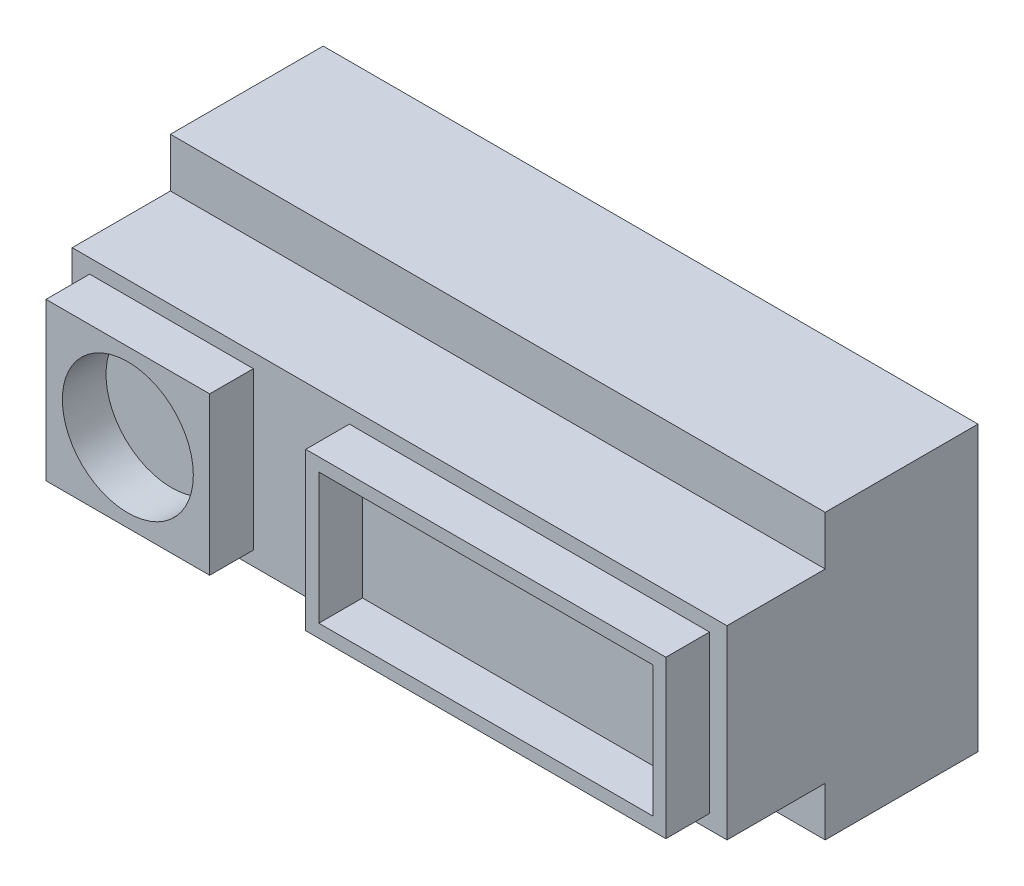
ISO-10303-21;
HEADER;
FILE_DESCRIPTION(('STEP AP214'),'2;1');
FILE_NAME('part.step','',(''),(''),'','','');
FILE_SCHEMA(('AUTOMOTIVE_DESIGN { 1 0 10303 214 1 1 1 1 }'));
ENDSEC;
DATA;
#1=APPLICATION_CONTEXT('core data for automotive mechanical design processes');
#2=APPLICATION_PROTOCOL_DEFINITION('international standard','automotive_design',2000,#1);
#3=PRODUCT_CONTEXT('',#1,'mechanical');
#4=PRODUCT('Part','Part','',(#3));
#5=PRODUCT_RELATED_PRODUCT_CATEGORY('part','',(#4));
#6=PRODUCT_DEFINITION_FORMATION('','',#4);
#7=PRODUCT_DEFINITION_CONTEXT('part definition',#1,'design');
#8=PRODUCT_DEFINITION('design','',#6,#7);
#9=PRODUCT_DEFINITION_SHAPE('','',#8);
#10=(LENGTH_UNIT() NAMED_UNIT(*) SI_UNIT(.MILLI.,.METRE.));
#11=(NAMED_UNIT(*) PLANE_ANGLE_UNIT() SI_UNIT($,.RADIAN.));
#12=(NAMED_UNIT(*) SI_UNIT($,.STERADIAN.) SOLID_ANGLE_UNIT());
#13=UNCERTAINTY_MEASURE_WITH_UNIT(LENGTH_MEASURE(1.E-05),#10,'distance_accuracy_value','');
#14=(GEOMETRIC_REPRESENTATION_CONTEXT(3) GLOBAL_UNCERTAINTY_ASSIGNED_CONTEXT((#13)) GLOBAL_UNIT_ASSIGNED_CONTEXT((#10,
#11,#12)) REPRESENTATION_CONTEXT('',''));
#15=CARTESIAN_POINT('',(0.,0.,0.));
#16=DIRECTION('',(0.,0.,1.));
#17=DIRECTION('',(1.,0.,0.));
#18=AXIS2_PLACEMENT_3D('',#15,#16,#17);
#19=CARTESIAN_POINT('',(-15.,2.25,11.5));
#20=DIRECTION('',(0.,1.,0.));
#21=DIRECTION('',(0.,0.,1.));
#22=AXIS2_PLACEMENT_3D('',#19,#20,#21);
#23=PLANE('',#22);
#24=DIRECTION('',(1.,0.,0.));
#25=VECTOR('',#24,1.);
#26=CARTESIAN_POINT('',(-15.,2.25,7.));
#27=LINE('',#26,#25);
#28=CARTESIAN_POINT('',(-15.,2.25,7.));
#29=VERTEX_POINT('',#28);
#30=CARTESIAN_POINT('',(-5.25,2.25,7.));
#31=VERTEX_POINT('',#30);
#32=EDGE_CURVE('E378',#29,#31,#27,.T.);
#33=ORIENTED_EDGE('',*,*,#32,.T.);
#34=DIRECTION('',(0.,0.,1.));
#35=VECTOR('',#34,1.);
#36=CARTESIAN_POINT('',(-5.25,2.25,-5.));
#37=LINE('',#36,#35);
#38=CARTESIAN_POINT('',(-5.25,2.25,0.));
#39=VERTEX_POINT('',#38);
#40=EDGE_CURVE('E255',#39,#31,#37,.T.);
#41=ORIENTED_EDGE('',*,*,#40,.F.);
#42=DIRECTION('',(-1.,0.,0.));
#43=VECTOR('',#42,1.);
#44=CARTESIAN_POINT('',(0.,2.25,0.));
#45=LINE('',#44,#43);
#46=CARTESIAN_POINT('',(5.25,2.25,0.));
#47=VERTEX_POINT('',#46);
#48=EDGE_CURVE('E269',#47,#39,#45,.T.);
#49=ORIENTED_EDGE('',*,*,#48,.F.);
#50=DIRECTION('',(0.,0.,1.));
#51=VECTOR('',#50,1.);
#52=CARTESIAN_POINT('',(5.25,2.25,-5.));
#53=LINE('',#52,#51);
#54=CARTESIAN_POINT('',(5.25,2.25,7.));
#55=VERTEX_POINT('',#54);
#56=EDGE_CURVE('E254',#47,#55,#53,.T.);
#57=ORIENTED_EDGE('',*,*,#56,.T.);
#58=CARTESIAN_POINT('',(15.,2.25,7.));
#59=VERTEX_POINT('',#58);
#60=EDGE_CURVE('E40',#55,#59,#27,.T.);
#61=ORIENTED_EDGE('',*,*,#60,.T.);
#62=DIRECTION('',(0.,0.,-1.));
#63=VECTOR('',#62,1.);
#64=CARTESIAN_POINT('',(15.,2.25,11.5));
#65=LINE('',#64,#63);
#66=CARTESIAN_POINT('',(15.,2.25,11.5));
#67=VERTEX_POINT('',#66);
#68=EDGE_CURVE('E385',#67,#59,#65,.T.);
#69=ORIENTED_EDGE('',*,*,#68,.F.);
#70=DIRECTION('',(1.,0.,0.));
#71=VECTOR('',#70,1.);
#72=CARTESIAN_POINT('',(-15.,2.25,11.5));
#73=LINE('',#72,#71);
#74=CARTESIAN_POINT('',(-15.,2.25,11.5));
#75=VERTEX_POINT('',#74);
#76=EDGE_CURVE('E365',#75,#67,#73,.T.);
#77=ORIENTED_EDGE('',*,*,#76,.F.);
#78=DIRECTION('',(0.,0.,-1.));
#79=VECTOR('',#78,1.);
#80=CARTESIAN_POINT('',(-15.,2.25,11.5));
#81=LINE('',#80,#79);
#82=EDGE_CURVE('E388',#75,#29,#81,.T.);
#83=ORIENTED_EDGE('',*,*,#82,.T.);
#84=EDGE_LOOP('',(#33,#41,#49,#57,#61,#69,#77,#83));
#85=FACE_BOUND('',#84,.T.);
#86=DIRECTION('',(0.,0.,-1.));
#87=VECTOR('',#86,1.);
#88=CARTESIAN_POINT('',(-5.,2.25,3.6));
#89=LINE('',#88,#87);
#90=CARTESIAN_POINT('',(-5.,2.25,3.6));
#91=VERTEX_POINT('',#90);
#92=CARTESIAN_POINT('',(-5.,2.25,2.5));
#93=VERTEX_POINT('',#92);
#94=EDGE_CURVE('E243',#91,#93,#89,.T.);
#95=ORIENTED_EDGE('',*,*,#94,.F.);
#96=DIRECTION('',(-1.,0.,0.));
#97=VECTOR('',#96,1.);
#98=CARTESIAN_POINT('',(-5.,2.25,3.6));
#99=LINE('',#98,#97);
#100=CARTESIAN_POINT('',(5.,2.25,3.6));
#101=VERTEX_POINT('',#100);
#102=EDGE_CURVE('E240',#101,#91,#99,.T.);
#103=ORIENTED_EDGE('',*,*,#102,.F.);
#104=DIRECTION('',(0.,0.,1.));
#105=VECTOR('',#104,1.);
#106=CARTESIAN_POINT('',(5.,2.25,3.6));
#107=LINE('',#106,#105);
#108=CARTESIAN_POINT('',(5.,2.25,2.5));
#109=VERTEX_POINT('',#108);
#110=EDGE_CURVE('E58',#109,#101,#107,.T.);
#111=ORIENTED_EDGE('',*,*,#110,.F.);
#112=DIRECTION('',(1.,0.,0.));
#113=VECTOR('',#112,1.);
#114=CARTESIAN_POINT('',(-5.,2.25,2.5));
#115=LINE('',#114,#113);
#116=EDGE_CURVE('E53',#93,#109,#115,.T.);
#117=ORIENTED_EDGE('',*,*,#116,.F.);
#118=EDGE_LOOP('',(#95,#103,#111,#117));
#119=FACE_BOUND('',#118,.T.);
#120=ADVANCED_FACE('F36',(#85,#119),#23,.F.);
#121=CARTESIAN_POINT('',(-15.,0.,1.4));
#122=DIRECTION('',(0.,1.,0.));
#123=DIRECTION('',(0.,0.,1.));
#124=AXIS2_PLACEMENT_3D('',#121,#122,#123);
#125=PLANE('',#124);
#126=DIRECTION('',(0.,0.,-1.));
#127=VECTOR('',#126,1.);
#128=CARTESIAN_POINT('',(-5.25,0.,1.4));
#129=LINE('',#128,#127);
#130=CARTESIAN_POINT('',(-5.25,0.,7.));
#131=VERTEX_POINT('',#130);
#132=CARTESIAN_POINT('',(-5.25,0.,0.));
#133=VERTEX_POINT('',#132);
#134=EDGE_CURVE('E267',#131,#133,#129,.T.);
#135=ORIENTED_EDGE('',*,*,#134,.F.);
#136=DIRECTION('',(1.,0.,0.));
#137=VECTOR('',#136,1.);
#138=CARTESIAN_POINT('',(-15.,0.,7.));
#139=LINE('',#138,#137);
#140=CARTESIAN_POINT('',(-15.,0.,7.));
#141=VERTEX_POINT('',#140);
#142=EDGE_CURVE('E421',#141,#131,#139,.T.);
#143=ORIENTED_EDGE('',*,*,#142,.F.);
#144=DIRECTION('',(0.,0.,-1.));
#145=VECTOR('',#144,1.);
#146=CARTESIAN_POINT('',(-15.,0.,1.4));
#147=LINE('',#146,#145);
#148=CARTESIAN_POINT('',(-15.,0.,0.));
#149=VERTEX_POINT('',#148);
#150=EDGE_CURVE('E442',#141,#149,#147,.T.);
#151=ORIENTED_EDGE('',*,*,#150,.T.);
#152=DIRECTION('',(1.,0.,0.));
#153=VECTOR('',#152,1.);
#154=CARTESIAN_POINT('',(-15.,0.,0.));
#155=LINE('',#154,#153);
#156=EDGE_CURVE('E448',#149,#133,#155,.T.);
#157=ORIENTED_EDGE('',*,*,#156,.T.);
#158=EDGE_LOOP('',(#135,#143,#151,#157));
#159=FACE_BOUND('',#158,.T.);
#160=ADVANCED_FACE('F493',(#159),#125,.F.);
#161=CARTESIAN_POINT('',(0.,0.,0.));
#162=DIRECTION('',(0.,0.,1.));
#163=DIRECTION('',(1.,0.,0.));
#164=AXIS2_PLACEMENT_3D('',#161,#162,#163);
#165=PLANE('',#164);
#166=DIRECTION('',(0.,1.,0.));
#167=VECTOR('',#166,1.);
#168=CARTESIAN_POINT('',(-5.25,0.,0.));
#169=LINE('',#168,#167);
#170=EDGE_CURVE('E265',#133,#39,#169,.T.);
#171=ORIENTED_EDGE('',*,*,#170,.F.);
#172=ORIENTED_EDGE('',*,*,#156,.F.);
#173=DIRECTION('',(0.,-1.,0.));
#174=VECTOR('',#173,1.);
#175=CARTESIAN_POINT('',(-15.,13.,0.));
#176=LINE('',#175,#174);
#177=CARTESIAN_POINT('',(-15.,13.,0.));
#178=VERTEX_POINT('',#177);
#179=EDGE_CURVE('E452',#178,#149,#176,.T.);
#180=ORIENTED_EDGE('',*,*,#179,.F.);
#181=DIRECTION('',(-1.,0.,0.));
#182=VECTOR('',#181,1.);
#183=CARTESIAN_POINT('',(15.,13.,0.));
#184=LINE('',#183,#182);
#185=CARTESIAN_POINT('',(15.,13.,0.));
#186=VERTEX_POINT('',#185);
#187=EDGE_CURVE('E454',#186,#178,#184,.T.);
#188=ORIENTED_EDGE('',*,*,#187,.F.);
#189=DIRECTION('',(0.,1.,0.));
#190=VECTOR('',#189,1.);
#191=CARTESIAN_POINT('',(15.,13.,0.));
#192=LINE('',#191,#190);
#193=CARTESIAN_POINT('',(15.,0.,0.));
#194=VERTEX_POINT('',#193);
#195=EDGE_CURVE('E455',#194,#186,#192,.T.);
#196=ORIENTED_EDGE('',*,*,#195,.F.);
#197=CARTESIAN_POINT('',(5.25,0.,0.));
#198=VERTEX_POINT('',#197);
#199=EDGE_CURVE('E451',#198,#194,#155,.T.);
#200=ORIENTED_EDGE('',*,*,#199,.F.);
#201=DIRECTION('',(0.,1.,0.));
#202=VECTOR('',#201,1.);
#203=CARTESIAN_POINT('',(5.25,0.,0.));
#204=LINE('',#203,#202);
#205=EDGE_CURVE('E257',#198,#47,#204,.T.);
#206=ORIENTED_EDGE('',*,*,#205,.T.);
#207=ORIENTED_EDGE('',*,*,#48,.T.);
#208=EDGE_LOOP('',(#171,#172,#180,#188,#196,#200,#206,#207));
#209=FACE_BOUND('',#208,.T.);
#210=ADVANCED_FACE('F483',(#209),#165,.F.);
#211=CARTESIAN_POINT('',(0.,0.,7.));
#212=DIRECTION('',(0.,0.,1.));
#213=DIRECTION('',(1.,0.,0.));
#214=AXIS2_PLACEMENT_3D('',#211,#212,#213);
#215=PLANE('',#214);
#216=ORIENTED_EDGE('',*,*,#142,.T.);
#217=DIRECTION('',(0.,1.,0.));
#218=VECTOR('',#217,1.);
#219=CARTESIAN_POINT('',(-5.25,0.,7.));
#220=LINE('',#219,#218);
#221=EDGE_CURVE('E246',#131,#31,#220,.T.);
#222=ORIENTED_EDGE('',*,*,#221,.T.);
#223=ORIENTED_EDGE('',*,*,#32,.F.);
#224=DIRECTION('',(0.,-1.,0.));
#225=VECTOR('',#224,1.);
#226=CARTESIAN_POINT('',(-15.,13.,7.));
#227=LINE('',#226,#225);
#228=EDGE_CURVE('E394',#29,#141,#227,.T.);
#229=ORIENTED_EDGE('',*,*,#228,.T.);
#230=EDGE_LOOP('',(#216,#222,#223,#229));
#231=FACE_BOUND('',#230,.T.);
#232=ADVANCED_FACE('F505',(#231),#215,.T.);
#233=CARTESIAN_POINT('',(0.,0.,11.5));
#234=DIRECTION('',(0.,0.,1.));
#235=DIRECTION('',(1.,0.,0.));
#236=AXIS2_PLACEMENT_3D('',#233,#234,#235);
#237=PLANE('',#236);
#238=DIRECTION('',(0.,-1.,0.));
#239=VECTOR('',#238,1.);
#240=CARTESIAN_POINT('',(-15.,10.75,11.5));
#241=LINE('',#240,#239);
#242=CARTESIAN_POINT('',(-15.,10.75,11.5));
#243=VERTEX_POINT('',#242);
#244=EDGE_CURVE('E362',#243,#75,#241,.T.);
#245=ORIENTED_EDGE('',*,*,#244,.T.);
#246=ORIENTED_EDGE('',*,*,#76,.T.);
#247=DIRECTION('',(0.,1.,0.));
#248=VECTOR('',#247,1.);
#249=CARTESIAN_POINT('',(15.,10.75,11.5));
#250=LINE('',#249,#248);
#251=CARTESIAN_POINT('',(15.,10.75,11.5));
#252=VERTEX_POINT('',#251);
#253=EDGE_CURVE('E368',#67,#252,#250,.T.);
#254=ORIENTED_EDGE('',*,*,#253,.T.);
#255=DIRECTION('',(-1.,0.,0.));
#256=VECTOR('',#255,1.);
#257=CARTESIAN_POINT('',(-15.,10.75,11.5));
#258=LINE('',#257,#256);
#259=EDGE_CURVE('E370',#252,#243,#258,.T.);
#260=ORIENTED_EDGE('',*,*,#259,.T.);
#261=EDGE_LOOP('',(#245,#246,#254,#260));
#262=FACE_BOUND('',#261,.T.);
#263=DIRECTION('',(1.,0.,0.));
#264=VECTOR('',#263,1.);
#265=CARTESIAN_POINT('',(-2.3,2.9,11.5));
#266=LINE('',#265,#264);
#267=CARTESIAN_POINT('',(-2.3,2.9,11.5));
#268=VERTEX_POINT('',#267);
#269=CARTESIAN_POINT('',(14.2,2.9,11.5));
#270=VERTEX_POINT('',#269);
#271=EDGE_CURVE('E347',#268,#270,#266,.T.);
#272=ORIENTED_EDGE('',*,*,#271,.F.);
#273=DIRECTION('',(0.,-1.,0.));
#274=VECTOR('',#273,1.);
#275=CARTESIAN_POINT('',(-2.3,10.1,11.5));
#276=LINE('',#275,#274);
#277=CARTESIAN_POINT('',(-2.3,10.1,11.5));
#278=VERTEX_POINT('',#277);
#279=EDGE_CURVE('E333',#278,#268,#276,.T.);
#280=ORIENTED_EDGE('',*,*,#279,.F.);
#281=DIRECTION('',(-1.,0.,0.));
#282=VECTOR('',#281,1.);
#283=CARTESIAN_POINT('',(-2.3,10.1,11.5));
#284=LINE('',#283,#282);
#285=CARTESIAN_POINT('',(14.2,10.1,11.5));
#286=VERTEX_POINT('',#285);
#287=EDGE_CURVE('E338',#286,#278,#284,.T.);
#288=ORIENTED_EDGE('',*,*,#287,.F.);
#289=DIRECTION('',(0.,1.,0.));
#290=VECTOR('',#289,1.);
#291=CARTESIAN_POINT('',(14.2,10.1,11.5));
#292=LINE('',#291,#290);
#293=EDGE_CURVE('E349',#270,#286,#292,.T.);
#294=ORIENTED_EDGE('',*,*,#293,.F.);
#295=EDGE_LOOP('',(#272,#280,#288,#294));
#296=FACE_BOUND('',#295,.T.);
#297=DIRECTION('',(1.,0.,0.));
#298=VECTOR('',#297,1.);
#299=CARTESIAN_POINT('',(-14.2,2.9,11.5));
#300=LINE('',#299,#298);
#301=CARTESIAN_POINT('',(-14.2,2.9,11.5));
#302=VERTEX_POINT('',#301);
#303=CARTESIAN_POINT('',(-6.7,2.9,11.5));
#304=VERTEX_POINT('',#303);
#305=EDGE_CURVE('E289',#302,#304,#300,.T.);
#306=ORIENTED_EDGE('',*,*,#305,.F.);
#307=DIRECTION('',(0.,-1.,0.));
#308=VECTOR('',#307,1.);
#309=CARTESIAN_POINT('',(-14.2,10.1,11.5));
#310=LINE('',#309,#308);
#311=CARTESIAN_POINT('',(-14.2,10.1,11.5));
#312=VERTEX_POINT('',#311);
#313=EDGE_CURVE('E275',#312,#302,#310,.T.);
#314=ORIENTED_EDGE('',*,*,#313,.F.);
#315=DIRECTION('',(-1.,0.,0.));
#316=VECTOR('',#315,1.);
#317=CARTESIAN_POINT('',(-14.2,10.1,11.5));
#318=LINE('',#317,#316);
#319=CARTESIAN_POINT('',(-6.7,10.1,11.5));
#320=VERTEX_POINT('',#319);
#321=EDGE_CURVE('E280',#320,#312,#318,.T.);
#322=ORIENTED_EDGE('',*,*,#321,.F.);
#323=DIRECTION('',(0.,1.,0.));
#324=VECTOR('',#323,1.);
#325=CARTESIAN_POINT('',(-6.7,10.1,11.5));
#326=LINE('',#325,#324);
#327=EDGE_CURVE('E291',#304,#320,#326,.T.);
#328=ORIENTED_EDGE('',*,*,#327,.F.);
#329=EDGE_LOOP('',(#306,#314,#322,#328));
#330=FACE_BOUND('',#329,.T.);
#331=ADVANCED_FACE('F467',(#262,#296,#330),#237,.T.);
#332=DIRECTION('',(-1.,0.,0.));
#333=VECTOR('',#332,1.);
#334=CARTESIAN_POINT('',(-15.,10.75,7.));
#335=LINE('',#334,#333);
#336=CARTESIAN_POINT('',(15.,10.75,7.));
#337=VERTEX_POINT('',#336);
#338=CARTESIAN_POINT('',(-15.,10.75,7.));
#339=VERTEX_POINT('',#338);
#340=EDGE_CURVE('E366',#337,#339,#335,.T.);
#341=ORIENTED_EDGE('',*,*,#340,.F.);
#342=DIRECTION('',(0.,1.,0.));
#343=VECTOR('',#342,1.);
#344=CARTESIAN_POINT('',(15.,13.,7.));
#345=LINE('',#344,#343);
#346=CARTESIAN_POINT('',(15.,13.,7.));
#347=VERTEX_POINT('',#346);
#348=EDGE_CURVE('E382',#337,#347,#345,.T.);
#349=ORIENTED_EDGE('',*,*,#348,.T.);
#350=DIRECTION('',(-1.,0.,0.));
#351=VECTOR('',#350,1.);
#352=CARTESIAN_POINT('',(-15.,13.,7.));
#353=LINE('',#352,#351);
#354=CARTESIAN_POINT('',(-15.,13.,7.));
#355=VERTEX_POINT('',#354);
#356=EDGE_CURVE('E423',#347,#355,#353,.T.);
#357=ORIENTED_EDGE('',*,*,#356,.T.);
#358=EDGE_CURVE('E429',#355,#339,#227,.T.);
#359=ORIENTED_EDGE('',*,*,#358,.T.);
#360=EDGE_LOOP('',(#341,#349,#357,#359));
#361=FACE_BOUND('',#360,.T.);
#362=ADVANCED_FACE('F458',(#361),#215,.T.);
#363=CARTESIAN_POINT('',(15.,13.,1.4));
#364=DIRECTION('',(-1.,0.,0.));
#365=DIRECTION('',(0.,0.,1.));
#366=AXIS2_PLACEMENT_3D('',#363,#364,#365);
#367=PLANE('',#366);
#368=ORIENTED_EDGE('',*,*,#195,.T.);
#369=DIRECTION('',(0.,0.,-1.));
#370=VECTOR('',#369,1.);
#371=CARTESIAN_POINT('',(15.,13.,1.4));
#372=LINE('',#371,#370);
#373=EDGE_CURVE('E46',#347,#186,#372,.T.);
#374=ORIENTED_EDGE('',*,*,#373,.F.);
#375=ORIENTED_EDGE('',*,*,#348,.F.);
#376=DIRECTION('',(0.,0.,-1.));
#377=VECTOR('',#376,1.);
#378=CARTESIAN_POINT('',(15.,10.75,11.5));
#379=LINE('',#378,#377);
#380=EDGE_CURVE('E389',#252,#337,#379,.T.);
#381=ORIENTED_EDGE('',*,*,#380,.F.);
#382=ORIENTED_EDGE('',*,*,#253,.F.);
#383=ORIENTED_EDGE('',*,*,#68,.T.);
#384=CARTESIAN_POINT('',(15.,0.,7.));
#385=VERTEX_POINT('',#384);
#386=EDGE_CURVE('E420',#385,#59,#345,.T.);
#387=ORIENTED_EDGE('',*,*,#386,.F.);
#388=DIRECTION('',(0.,0.,-1.));
#389=VECTOR('',#388,1.);
#390=CARTESIAN_POINT('',(15.,0.,1.4));
#391=LINE('',#390,#389);
#392=EDGE_CURVE('E445',#385,#194,#391,.T.);
#393=ORIENTED_EDGE('',*,*,#392,.T.);
#394=EDGE_LOOP('',(#368,#374,#375,#381,#382,#383,#387,#393));
#395=FACE_BOUND('',#394,.T.);
#396=ADVANCED_FACE('F38',(#395),#367,.F.);
#397=CARTESIAN_POINT('',(15.,13.,1.4));
#398=DIRECTION('',(0.,-1.,0.));
#399=DIRECTION('',(0.,0.,-1.));
#400=AXIS2_PLACEMENT_3D('',#397,#398,#399);
#401=PLANE('',#400);
#402=ORIENTED_EDGE('',*,*,#187,.T.);
#403=DIRECTION('',(0.,0.,-1.));
#404=VECTOR('',#403,1.);
#405=CARTESIAN_POINT('',(-15.,13.,1.4));
#406=LINE('',#405,#404);
#407=EDGE_CURVE('E439',#355,#178,#406,.T.);
#408=ORIENTED_EDGE('',*,*,#407,.F.);
#409=ORIENTED_EDGE('',*,*,#356,.F.);
#410=ORIENTED_EDGE('',*,*,#373,.T.);
#411=EDGE_LOOP('',(#402,#408,#409,#410));
#412=FACE_BOUND('',#411,.T.);
#413=ADVANCED_FACE('F485',(#412),#401,.F.);
#414=CARTESIAN_POINT('',(-15.,13.,1.4));
#415=DIRECTION('',(1.,0.,0.));
#416=DIRECTION('',(0.,0.,-1.));
#417=AXIS2_PLACEMENT_3D('',#414,#415,#416);
#418=PLANE('',#417);
#419=ORIENTED_EDGE('',*,*,#179,.T.);
#420=ORIENTED_EDGE('',*,*,#150,.F.);
#421=ORIENTED_EDGE('',*,*,#228,.F.);
#422=ORIENTED_EDGE('',*,*,#82,.F.);
#423=ORIENTED_EDGE('',*,*,#244,.F.);
#424=DIRECTION('',(0.,0.,-1.));
#425=VECTOR('',#424,1.);
#426=CARTESIAN_POINT('',(-15.,10.75,11.5));
#427=LINE('',#426,#425);
#428=EDGE_CURVE('E371',#243,#339,#427,.T.);
#429=ORIENTED_EDGE('',*,*,#428,.T.);
#430=ORIENTED_EDGE('',*,*,#358,.F.);
#431=ORIENTED_EDGE('',*,*,#407,.T.);
#432=EDGE_LOOP('',(#419,#420,#421,#422,#423,#429,#430,#431));
#433=FACE_BOUND('',#432,.T.);
#434=ADVANCED_FACE('F461',(#433),#418,.F.);
#435=CARTESIAN_POINT('',(5.25,0.,7.));
#436=VERTEX_POINT('',#435);
#437=EDGE_CURVE('E425',#436,#385,#139,.T.);
#438=ORIENTED_EDGE('',*,*,#437,.F.);
#439=DIRECTION('',(0.,0.,-1.));
#440=VECTOR('',#439,1.);
#441=CARTESIAN_POINT('',(5.25,0.,1.4));
#442=LINE('',#441,#440);
#443=EDGE_CURVE('E262',#436,#198,#442,.T.);
#444=ORIENTED_EDGE('',*,*,#443,.T.);
#445=ORIENTED_EDGE('',*,*,#199,.T.);
#446=ORIENTED_EDGE('',*,*,#392,.F.);
#447=EDGE_LOOP('',(#438,#444,#445,#446));
#448=FACE_BOUND('',#447,.T.);
#449=ADVANCED_FACE('F479',(#448),#125,.F.);
#450=DIRECTION('',(0.,1.,0.));
#451=VECTOR('',#450,1.);
#452=CARTESIAN_POINT('',(5.25,0.,7.));
#453=LINE('',#452,#451);
#454=EDGE_CURVE('E244',#436,#55,#453,.T.);
#455=ORIENTED_EDGE('',*,*,#454,.F.);
#456=ORIENTED_EDGE('',*,*,#437,.T.);
#457=ORIENTED_EDGE('',*,*,#386,.T.);
#458=ORIENTED_EDGE('',*,*,#60,.F.);
#459=EDGE_LOOP('',(#455,#456,#457,#458));
#460=FACE_BOUND('',#459,.T.);
#461=ADVANCED_FACE('F476',(#460),#215,.T.);
#462=CARTESIAN_POINT('',(-15.,10.75,11.5));
#463=DIRECTION('',(0.,-1.,0.));
#464=DIRECTION('',(0.,0.,-1.));
#465=AXIS2_PLACEMENT_3D('',#462,#463,#464);
#466=PLANE('',#465);
#467=ORIENTED_EDGE('',*,*,#340,.T.);
#468=ORIENTED_EDGE('',*,*,#428,.F.);
#469=ORIENTED_EDGE('',*,*,#259,.F.);
#470=ORIENTED_EDGE('',*,*,#380,.T.);
#471=EDGE_LOOP('',(#467,#468,#469,#470));
#472=FACE_BOUND('',#471,.T.);
#473=ADVANCED_FACE('F409',(#472),#466,.F.);
#474=CARTESIAN_POINT('',(0.,0.,13.5));
#475=DIRECTION('',(0.,0.,1.));
#476=DIRECTION('',(1.,0.,0.));
#477=AXIS2_PLACEMENT_3D('',#474,#475,#476);
#478=PLANE('',#477);
#479=DIRECTION('',(0.,-1.,0.));
#480=VECTOR('',#479,1.);
#481=CARTESIAN_POINT('',(-2.3,10.1,13.5));
#482=LINE('',#481,#480);
#483=CARTESIAN_POINT('',(-2.3,10.1,13.5));
#484=VERTEX_POINT('',#483);
#485=CARTESIAN_POINT('',(-2.3,2.9,13.5));
#486=VERTEX_POINT('',#485);
#487=EDGE_CURVE('E334',#484,#486,#482,.T.);
#488=ORIENTED_EDGE('',*,*,#487,.T.);
#489=DIRECTION('',(1.,0.,0.));
#490=VECTOR('',#489,1.);
#491=CARTESIAN_POINT('',(-2.3,2.9,13.5));
#492=LINE('',#491,#490);
#493=CARTESIAN_POINT('',(14.2,2.9,13.5));
#494=VERTEX_POINT('',#493);
#495=EDGE_CURVE('E337',#486,#494,#492,.T.);
#496=ORIENTED_EDGE('',*,*,#495,.T.);
#497=DIRECTION('',(0.,1.,0.));
#498=VECTOR('',#497,1.);
#499=CARTESIAN_POINT('',(14.2,10.1,13.5));
#500=LINE('',#499,#498);
#501=CARTESIAN_POINT('',(14.2,10.1,13.5));
#502=VERTEX_POINT('',#501);
#503=EDGE_CURVE('E340',#494,#502,#500,.T.);
#504=ORIENTED_EDGE('',*,*,#503,.T.);
#505=DIRECTION('',(-1.,0.,0.));
#506=VECTOR('',#505,1.);
#507=CARTESIAN_POINT('',(-2.3,10.1,13.5));
#508=LINE('',#507,#506);
#509=EDGE_CURVE('E342',#502,#484,#508,.T.);
#510=ORIENTED_EDGE('',*,*,#509,.T.);
#511=EDGE_LOOP('',(#488,#496,#504,#510));
#512=FACE_BOUND('',#511,.T.);
#513=DIRECTION('',(1.,0.,0.));
#514=VECTOR('',#513,1.);
#515=CARTESIAN_POINT('',(-1.7,3.5,13.5));
#516=LINE('',#515,#514);
#517=CARTESIAN_POINT('',(-1.7,3.5,13.5));
#518=VERTEX_POINT('',#517);
#519=CARTESIAN_POINT('',(13.6,3.5,13.5));
#520=VERTEX_POINT('',#519);
#521=EDGE_CURVE('E307',#518,#520,#516,.T.);
#522=ORIENTED_EDGE('',*,*,#521,.F.);
#523=DIRECTION('',(0.,-1.,0.));
#524=VECTOR('',#523,1.);
#525=CARTESIAN_POINT('',(-1.7,9.5,13.5));
#526=LINE('',#525,#524);
#527=CARTESIAN_POINT('',(-1.7,9.5,13.5));
#528=VERTEX_POINT('',#527);
#529=EDGE_CURVE('E305',#528,#518,#526,.T.);
#530=ORIENTED_EDGE('',*,*,#529,.F.);
#531=DIRECTION('',(-1.,0.,0.));
#532=VECTOR('',#531,1.);
#533=CARTESIAN_POINT('',(-1.7,9.5,13.5));
#534=LINE('',#533,#532);
#535=CARTESIAN_POINT('',(13.6,9.5,13.5));
#536=VERTEX_POINT('',#535);
#537=EDGE_CURVE('E313',#536,#528,#534,.T.);
#538=ORIENTED_EDGE('',*,*,#537,.F.);
#539=DIRECTION('',(0.,1.,0.));
#540=VECTOR('',#539,1.);
#541=CARTESIAN_POINT('',(13.6,9.5,13.5));
#542=LINE('',#541,#540);
#543=EDGE_CURVE('E310',#520,#536,#542,.T.);
#544=ORIENTED_EDGE('',*,*,#543,.F.);
#545=EDGE_LOOP('',(#522,#530,#538,#544));
#546=FACE_BOUND('',#545,.T.);
#547=ADVANCED_FACE('F524',(#512,#546),#478,.T.);
#548=CARTESIAN_POINT('',(-2.3,10.1,13.5));
#549=DIRECTION('',(1.,0.,0.));
#550=DIRECTION('',(0.,1.,0.));
#551=AXIS2_PLACEMENT_3D('',#548,#549,#550);
#552=PLANE('',#551);
#553=ORIENTED_EDGE('',*,*,#279,.T.);
#554=DIRECTION('',(0.,0.,-1.));
#555=VECTOR('',#554,1.);
#556=CARTESIAN_POINT('',(-2.3,2.9,13.5));
#557=LINE('',#556,#555);
#558=EDGE_CURVE('E360',#486,#268,#557,.T.);
#559=ORIENTED_EDGE('',*,*,#558,.F.);
#560=ORIENTED_EDGE('',*,*,#487,.F.);
#561=DIRECTION('',(0.,0.,-1.));
#562=VECTOR('',#561,1.);
#563=CARTESIAN_POINT('',(-2.3,10.1,13.5));
#564=LINE('',#563,#562);
#565=EDGE_CURVE('E344',#484,#278,#564,.T.);
#566=ORIENTED_EDGE('',*,*,#565,.T.);
#567=EDGE_LOOP('',(#553,#559,#560,#566));
#568=FACE_BOUND('',#567,.T.);
#569=ADVANCED_FACE('F531',(#568),#552,.F.);
#570=CARTESIAN_POINT('',(-2.3,2.9,13.5));
#571=DIRECTION('',(0.,1.,0.));
#572=DIRECTION('',(0.,0.,1.));
#573=AXIS2_PLACEMENT_3D('',#570,#571,#572);
#574=PLANE('',#573);
#575=ORIENTED_EDGE('',*,*,#271,.T.);
#576=DIRECTION('',(0.,0.,-1.));
#577=VECTOR('',#576,1.);
#578=CARTESIAN_POINT('',(14.2,2.9,13.5));
#579=LINE('',#578,#577);
#580=EDGE_CURVE('E357',#494,#270,#579,.T.);
#581=ORIENTED_EDGE('',*,*,#580,.F.);
#582=ORIENTED_EDGE('',*,*,#495,.F.);
#583=ORIENTED_EDGE('',*,*,#558,.T.);
#584=EDGE_LOOP('',(#575,#581,#582,#583));
#585=FACE_BOUND('',#584,.T.);
#586=ADVANCED_FACE('F539',(#585),#574,.F.);
#587=CARTESIAN_POINT('',(14.2,10.1,13.5));
#588=DIRECTION('',(-1.,0.,0.));
#589=DIRECTION('',(0.,-1.,0.));
#590=AXIS2_PLACEMENT_3D('',#587,#588,#589);
#591=PLANE('',#590);
#592=ORIENTED_EDGE('',*,*,#293,.T.);
#593=DIRECTION('',(0.,0.,-1.));
#594=VECTOR('',#593,1.);
#595=CARTESIAN_POINT('',(14.2,10.1,13.5));
#596=LINE('',#595,#594);
#597=EDGE_CURVE('E355',#502,#286,#596,.T.);
#598=ORIENTED_EDGE('',*,*,#597,.F.);
#599=ORIENTED_EDGE('',*,*,#503,.F.);
#600=ORIENTED_EDGE('',*,*,#580,.T.);
#601=EDGE_LOOP('',(#592,#598,#599,#600));
#602=FACE_BOUND('',#601,.T.);
#603=ADVANCED_FACE('F547',(#602),#591,.F.);
#604=CARTESIAN_POINT('',(-2.3,10.1,13.5));
#605=DIRECTION('',(0.,-1.,0.));
#606=DIRECTION('',(0.,0.,-1.));
#607=AXIS2_PLACEMENT_3D('',#604,#605,#606);
#608=PLANE('',#607);
#609=ORIENTED_EDGE('',*,*,#287,.T.);
#610=ORIENTED_EDGE('',*,*,#565,.F.);
#611=ORIENTED_EDGE('',*,*,#509,.F.);
#612=ORIENTED_EDGE('',*,*,#597,.T.);
#613=EDGE_LOOP('',(#609,#610,#611,#612));
#614=FACE_BOUND('',#613,.T.);
#615=ADVANCED_FACE('F555',(#614),#608,.F.);
#616=CARTESIAN_POINT('',(-1.7,9.5,13.5));
#617=DIRECTION('',(1.,0.,0.));
#618=DIRECTION('',(0.,1.,0.));
#619=AXIS2_PLACEMENT_3D('',#616,#617,#618);
#620=PLANE('',#619);
#621=DIRECTION('',(0.,-1.,0.));
#622=VECTOR('',#621,1.);
#623=CARTESIAN_POINT('',(-1.7,9.5,11.5));
#624=LINE('',#623,#622);
#625=CARTESIAN_POINT('',(-1.7,9.5,11.5));
#626=VERTEX_POINT('',#625);
#627=CARTESIAN_POINT('',(-1.7,3.5,11.5));
#628=VERTEX_POINT('',#627);
#629=EDGE_CURVE('E304',#626,#628,#624,.T.);
#630=ORIENTED_EDGE('',*,*,#629,.F.);
#631=DIRECTION('',(0.,0.,-1.));
#632=VECTOR('',#631,1.);
#633=CARTESIAN_POINT('',(-1.7,9.5,13.5));
#634=LINE('',#633,#632);
#635=EDGE_CURVE('E315',#528,#626,#634,.T.);
#636=ORIENTED_EDGE('',*,*,#635,.F.);
#637=ORIENTED_EDGE('',*,*,#529,.T.);
#638=DIRECTION('',(0.,0.,-1.));
#639=VECTOR('',#638,1.);
#640=CARTESIAN_POINT('',(-1.7,3.5,13.5));
#641=LINE('',#640,#639);
#642=EDGE_CURVE('E330',#518,#628,#641,.T.);
#643=ORIENTED_EDGE('',*,*,#642,.T.);
#644=EDGE_LOOP('',(#630,#636,#637,#643));
#645=FACE_BOUND('',#644,.T.);
#646=ADVANCED_FACE('F563',(#645),#620,.T.);
#647=CARTESIAN_POINT('',(-1.7,3.5,13.5));
#648=DIRECTION('',(0.,1.,0.));
#649=DIRECTION('',(-1.,0.,0.));
#650=AXIS2_PLACEMENT_3D('',#647,#648,#649);
#651=PLANE('',#650);
#652=DIRECTION('',(1.,0.,0.));
#653=VECTOR('',#652,1.);
#654=CARTESIAN_POINT('',(-1.7,3.5,11.5));
#655=LINE('',#654,#653);
#656=CARTESIAN_POINT('',(13.6,3.5,11.5));
#657=VERTEX_POINT('',#656);
#658=EDGE_CURVE('E317',#628,#657,#655,.T.);
#659=ORIENTED_EDGE('',*,*,#658,.F.);
#660=ORIENTED_EDGE('',*,*,#642,.F.);
#661=ORIENTED_EDGE('',*,*,#521,.T.);
#662=DIRECTION('',(0.,0.,-1.));
#663=VECTOR('',#662,1.);
#664=CARTESIAN_POINT('',(13.6,3.5,13.5));
#665=LINE('',#664,#663);
#666=EDGE_CURVE('E327',#520,#657,#665,.T.);
#667=ORIENTED_EDGE('',*,*,#666,.T.);
#668=EDGE_LOOP('',(#659,#660,#661,#667));
#669=FACE_BOUND('',#668,.T.);
#670=ADVANCED_FACE('F571',(#669),#651,.T.);
#671=CARTESIAN_POINT('',(13.6,9.5,13.5));
#672=DIRECTION('',(-1.,0.,0.));
#673=DIRECTION('',(0.,0.,1.));
#674=AXIS2_PLACEMENT_3D('',#671,#672,#673);
#675=PLANE('',#674);
#676=DIRECTION('',(0.,1.,0.));
#677=VECTOR('',#676,1.);
#678=CARTESIAN_POINT('',(13.6,9.5,11.5));
#679=LINE('',#678,#677);
#680=CARTESIAN_POINT('',(13.6,9.5,11.5));
#681=VERTEX_POINT('',#680);
#682=EDGE_CURVE('E319',#657,#681,#679,.T.);
#683=ORIENTED_EDGE('',*,*,#682,.F.);
#684=ORIENTED_EDGE('',*,*,#666,.F.);
#685=ORIENTED_EDGE('',*,*,#543,.T.);
#686=DIRECTION('',(0.,0.,-1.));
#687=VECTOR('',#686,1.);
#688=CARTESIAN_POINT('',(13.6,9.5,13.5));
#689=LINE('',#688,#687);
#690=EDGE_CURVE('E324',#536,#681,#689,.T.);
#691=ORIENTED_EDGE('',*,*,#690,.T.);
#692=EDGE_LOOP('',(#683,#684,#685,#691));
#693=FACE_BOUND('',#692,.T.);
#694=ADVANCED_FACE('F579',(#693),#675,.T.);
#695=CARTESIAN_POINT('',(-1.7,9.5,13.5));
#696=DIRECTION('',(0.,-1.,0.));
#697=DIRECTION('',(0.,0.,-1.));
#698=AXIS2_PLACEMENT_3D('',#695,#696,#697);
#699=PLANE('',#698);
#700=DIRECTION('',(-1.,0.,0.));
#701=VECTOR('',#700,1.);
#702=CARTESIAN_POINT('',(-1.7,9.5,11.5));
#703=LINE('',#702,#701);
#704=EDGE_CURVE('E308',#681,#626,#703,.T.);
#705=ORIENTED_EDGE('',*,*,#704,.F.);
#706=ORIENTED_EDGE('',*,*,#690,.F.);
#707=ORIENTED_EDGE('',*,*,#537,.T.);
#708=ORIENTED_EDGE('',*,*,#635,.T.);
#709=EDGE_LOOP('',(#705,#706,#707,#708));
#710=FACE_BOUND('',#709,.T.);
#711=ADVANCED_FACE('F587',(#710),#699,.T.);
#712=ORIENTED_EDGE('',*,*,#629,.T.);
#713=ORIENTED_EDGE('',*,*,#658,.T.);
#714=ORIENTED_EDGE('',*,*,#682,.T.);
#715=ORIENTED_EDGE('',*,*,#704,.T.);
#716=EDGE_LOOP('',(#712,#713,#714,#715));
#717=FACE_BOUND('',#716,.T.);
#718=ADVANCED_FACE('F595',(#717),#237,.T.);
#719=CARTESIAN_POINT('',(0.,0.,13.5));
#720=DIRECTION('',(0.,0.,1.));
#721=DIRECTION('',(1.,0.,0.));
#722=AXIS2_PLACEMENT_3D('',#719,#720,#721);
#723=PLANE('',#722);
#724=DIRECTION('',(0.,-1.,0.));
#725=VECTOR('',#724,1.);
#726=CARTESIAN_POINT('',(-14.2,10.1,13.5));
#727=LINE('',#726,#725);
#728=CARTESIAN_POINT('',(-14.2,10.1,13.5));
#729=VERTEX_POINT('',#728);
#730=CARTESIAN_POINT('',(-14.2,2.9,13.5));
#731=VERTEX_POINT('',#730);
#732=EDGE_CURVE('E276',#729,#731,#727,.T.);
#733=ORIENTED_EDGE('',*,*,#732,.T.);
#734=DIRECTION('',(1.,0.,0.));
#735=VECTOR('',#734,1.);
#736=CARTESIAN_POINT('',(-14.2,2.9,13.5));
#737=LINE('',#736,#735);
#738=CARTESIAN_POINT('',(-6.7,2.9,13.5));
#739=VERTEX_POINT('',#738);
#740=EDGE_CURVE('E279',#731,#739,#737,.T.);
#741=ORIENTED_EDGE('',*,*,#740,.T.);
#742=DIRECTION('',(0.,1.,0.));
#743=VECTOR('',#742,1.);
#744=CARTESIAN_POINT('',(-6.7,10.1,13.5));
#745=LINE('',#744,#743);
#746=CARTESIAN_POINT('',(-6.7,10.1,13.5));
#747=VERTEX_POINT('',#746);
#748=EDGE_CURVE('E282',#739,#747,#745,.T.);
#749=ORIENTED_EDGE('',*,*,#748,.T.);
#750=DIRECTION('',(-1.,0.,0.));
#751=VECTOR('',#750,1.);
#752=CARTESIAN_POINT('',(-14.2,10.1,13.5));
#753=LINE('',#752,#751);
#754=EDGE_CURVE('E284',#747,#729,#753,.T.);
#755=ORIENTED_EDGE('',*,*,#754,.T.);
#756=EDGE_LOOP('',(#733,#741,#749,#755));
#757=FACE_BOUND('',#756,.T.);
#758=CARTESIAN_POINT('',(-10.45,6.5,13.5));
#759=DIRECTION('',(0.,0.,1.));
#760=DIRECTION('',(1.,0.,0.));
#761=AXIS2_PLACEMENT_3D('',#758,#759,#760);
#762=CIRCLE('',#761,3.);
#763=CARTESIAN_POINT('',(-7.45,6.5,13.5));
#764=VERTEX_POINT('',#763);
#765=EDGE_CURVE('E272',#764,#764,#762,.T.);
#766=ORIENTED_EDGE('',*,*,#765,.F.);
#767=EDGE_LOOP('',(#766));
#768=FACE_BOUND('',#767,.T.);
#769=ADVANCED_FACE('F603',(#757,#768),#723,.T.);
#770=CARTESIAN_POINT('',(-14.2,10.1,13.5));
#771=DIRECTION('',(1.,0.,0.));
#772=DIRECTION('',(0.,0.,-1.));
#773=AXIS2_PLACEMENT_3D('',#770,#771,#772);
#774=PLANE('',#773);
#775=ORIENTED_EDGE('',*,*,#313,.T.);
#776=DIRECTION('',(0.,0.,-1.));
#777=VECTOR('',#776,1.);
#778=CARTESIAN_POINT('',(-14.2,2.9,13.5));
#779=LINE('',#778,#777);
#780=EDGE_CURVE('E302',#731,#302,#779,.T.);
#781=ORIENTED_EDGE('',*,*,#780,.F.);
#782=ORIENTED_EDGE('',*,*,#732,.F.);
#783=DIRECTION('',(0.,0.,-1.));
#784=VECTOR('',#783,1.);
#785=CARTESIAN_POINT('',(-14.2,10.1,13.5));
#786=LINE('',#785,#784);
#787=EDGE_CURVE('E286',#729,#312,#786,.T.);
#788=ORIENTED_EDGE('',*,*,#787,.T.);
#789=EDGE_LOOP('',(#775,#781,#782,#788));
#790=FACE_BOUND('',#789,.T.);
#791=ADVANCED_FACE('F611',(#790),#774,.F.);
#792=CARTESIAN_POINT('',(-14.2,2.9,13.5));
#793=DIRECTION('',(0.,1.,0.));
#794=DIRECTION('',(0.,0.,1.));
#795=AXIS2_PLACEMENT_3D('',#792,#793,#794);
#796=PLANE('',#795);
#797=ORIENTED_EDGE('',*,*,#305,.T.);
#798=DIRECTION('',(0.,0.,-1.));
#799=VECTOR('',#798,1.);
#800=CARTESIAN_POINT('',(-6.7,2.9,13.5));
#801=LINE('',#800,#799);
#802=EDGE_CURVE('E299',#739,#304,#801,.T.);
#803=ORIENTED_EDGE('',*,*,#802,.F.);
#804=ORIENTED_EDGE('',*,*,#740,.F.);
#805=ORIENTED_EDGE('',*,*,#780,.T.);
#806=EDGE_LOOP('',(#797,#803,#804,#805));
#807=FACE_BOUND('',#806,.T.);
#808=ADVANCED_FACE('F619',(#807),#796,.F.);
#809=CARTESIAN_POINT('',(-6.7,10.1,13.5));
#810=DIRECTION('',(-1.,0.,0.));
#811=DIRECTION('',(0.,-1.,0.));
#812=AXIS2_PLACEMENT_3D('',#809,#810,#811);
#813=PLANE('',#812);
#814=ORIENTED_EDGE('',*,*,#327,.T.);
#815=DIRECTION('',(0.,0.,-1.));
#816=VECTOR('',#815,1.);
#817=CARTESIAN_POINT('',(-6.7,10.1,13.5));
#818=LINE('',#817,#816);
#819=EDGE_CURVE('E297',#747,#320,#818,.T.);
#820=ORIENTED_EDGE('',*,*,#819,.F.);
#821=ORIENTED_EDGE('',*,*,#748,.F.);
#822=ORIENTED_EDGE('',*,*,#802,.T.);
#823=EDGE_LOOP('',(#814,#820,#821,#822));
#824=FACE_BOUND('',#823,.T.);
#825=ADVANCED_FACE('F627',(#824),#813,.F.);
#826=CARTESIAN_POINT('',(-14.2,10.1,13.5));
#827=DIRECTION('',(0.,-1.,0.));
#828=DIRECTION('',(0.,0.,-1.));
#829=AXIS2_PLACEMENT_3D('',#826,#827,#828);
#830=PLANE('',#829);
#831=ORIENTED_EDGE('',*,*,#321,.T.);
#832=ORIENTED_EDGE('',*,*,#787,.F.);
#833=ORIENTED_EDGE('',*,*,#754,.F.);
#834=ORIENTED_EDGE('',*,*,#819,.T.);
#835=EDGE_LOOP('',(#831,#832,#833,#834));
#836=FACE_BOUND('',#835,.T.);
#837=ADVANCED_FACE('F635',(#836),#830,.F.);
#838=CARTESIAN_POINT('',(-10.45,6.5,13.5));
#839=DIRECTION('',(0.,0.,-1.));
#840=DIRECTION('',(-1.,0.,0.));
#841=AXIS2_PLACEMENT_3D('',#838,#839,#840);
#842=CYLINDRICAL_SURFACE('',#841,3.);
#843=ORIENTED_EDGE('',*,*,#765,.T.);
#844=EDGE_LOOP('',(#843));
#845=FACE_BOUND('',#844,.T.);
#846=CARTESIAN_POINT('',(-10.45,6.5,11.5));
#847=DIRECTION('',(0.,0.,1.));
#848=DIRECTION('',(1.,0.,0.));
#849=AXIS2_PLACEMENT_3D('',#846,#847,#848);
#850=CIRCLE('',#849,3.);
#851=CARTESIAN_POINT('',(-7.45,6.5,11.5));
#852=VERTEX_POINT('',#851);
#853=EDGE_CURVE('E11',#852,#852,#850,.F.);
#854=ORIENTED_EDGE('',*,*,#853,.T.);
#855=EDGE_LOOP('',(#854));
#856=FACE_BOUND('',#855,.T.);
#857=ADVANCED_FACE('F643',(#845,#856),#842,.F.);
#858=ORIENTED_EDGE('',*,*,#853,.F.);
#859=EDGE_LOOP('',(#858));
#860=FACE_BOUND('',#859,.T.);
#861=ADVANCED_FACE('F605',(#860),#237,.T.);
#862=CARTESIAN_POINT('',(-5.25,0.,-5.));
#863=DIRECTION('',(1.,0.,0.));
#864=DIRECTION('',(0.,0.,-1.));
#865=AXIS2_PLACEMENT_3D('',#862,#863,#864);
#866=PLANE('',#865);
#867=ORIENTED_EDGE('',*,*,#134,.T.);
#868=ORIENTED_EDGE('',*,*,#170,.T.);
#869=ORIENTED_EDGE('',*,*,#40,.T.);
#870=ORIENTED_EDGE('',*,*,#221,.F.);
#871=EDGE_LOOP('',(#867,#868,#869,#870));
#872=FACE_BOUND('',#871,.T.);
#873=ADVANCED_FACE('F658',(#872),#866,.T.);
#874=CARTESIAN_POINT('',(5.25,0.,-5.));
#875=DIRECTION('',(1.,0.,0.));
#876=DIRECTION('',(0.,0.,-1.));
#877=AXIS2_PLACEMENT_3D('',#874,#875,#876);
#878=PLANE('',#877);
#879=ORIENTED_EDGE('',*,*,#454,.T.);
#880=ORIENTED_EDGE('',*,*,#56,.F.);
#881=ORIENTED_EDGE('',*,*,#205,.F.);
#882=ORIENTED_EDGE('',*,*,#443,.F.);
#883=EDGE_LOOP('',(#879,#880,#881,#882));
#884=FACE_BOUND('',#883,.T.);
#885=ADVANCED_FACE('F665',(#884),#878,.F.);
#886=CARTESIAN_POINT('',(-5.,-5.8,3.6));
#887=DIRECTION('',(1.,0.,0.));
#888=DIRECTION('',(0.,0.,-1.));
#889=AXIS2_PLACEMENT_3D('',#886,#887,#888);
#890=PLANE('',#889);
#891=ORIENTED_EDGE('',*,*,#94,.T.);
#892=DIRECTION('',(0.,1.,0.));
#893=VECTOR('',#892,1.);
#894=CARTESIAN_POINT('',(-5.,-5.8,2.5));
#895=LINE('',#894,#893);
#896=CARTESIAN_POINT('',(-5.,-5.8,2.5));
#897=VERTEX_POINT('',#896);
#898=EDGE_CURVE('E224',#897,#93,#895,.T.);
#899=ORIENTED_EDGE('',*,*,#898,.F.);
#900=DIRECTION('',(0.,0.,-1.));
#901=VECTOR('',#900,1.);
#902=CARTESIAN_POINT('',(-5.,-5.8,3.6));
#903=LINE('',#902,#901);
#904=CARTESIAN_POINT('',(-5.,-5.8,3.6));
#905=VERTEX_POINT('',#904);
#906=EDGE_CURVE('E231',#905,#897,#903,.T.);
#907=ORIENTED_EDGE('',*,*,#906,.F.);
#908=DIRECTION('',(0.,1.,0.));
#909=VECTOR('',#908,1.);
#910=CARTESIAN_POINT('',(-5.,-5.8,3.6));
#911=LINE('',#910,#909);
#912=EDGE_CURVE('E866',#905,#91,#911,.T.);
#913=ORIENTED_EDGE('',*,*,#912,.T.);
#914=EDGE_LOOP('',(#891,#899,#907,#913));
#915=FACE_BOUND('',#914,.T.);
#916=ADVANCED_FACE('F242',(#915),#890,.F.);
#917=CARTESIAN_POINT('',(-5.,-5.8,2.5));
#918=DIRECTION('',(0.,0.,1.));
#919=DIRECTION('',(1.,0.,0.));
#920=AXIS2_PLACEMENT_3D('',#917,#918,#919);
#921=PLANE('',#920);
#922=ORIENTED_EDGE('',*,*,#116,.T.);
#923=DIRECTION('',(0.,1.,0.));
#924=VECTOR('',#923,1.);
#925=CARTESIAN_POINT('',(5.,-5.8,2.5));
#926=LINE('',#925,#924);
#927=CARTESIAN_POINT('',(5.,-5.8,2.5));
#928=VERTEX_POINT('',#927);
#929=EDGE_CURVE('E227',#928,#109,#926,.T.);
#930=ORIENTED_EDGE('',*,*,#929,.F.);
#931=DIRECTION('',(1.,0.,0.));
#932=VECTOR('',#931,1.);
#933=CARTESIAN_POINT('',(-5.,-5.8,2.5));
#934=LINE('',#933,#932);
#935=EDGE_CURVE('E220',#897,#928,#934,.T.);
#936=ORIENTED_EDGE('',*,*,#935,.F.);
#937=ORIENTED_EDGE('',*,*,#898,.T.);
#938=EDGE_LOOP('',(#922,#930,#936,#937));
#939=FACE_BOUND('',#938,.T.);
#940=ADVANCED_FACE('F222',(#939),#921,.F.);
#941=CARTESIAN_POINT('',(5.,-5.8,3.6));
#942=DIRECTION('',(-1.,0.,0.));
#943=DIRECTION('',(0.,0.,1.));
#944=AXIS2_PLACEMENT_3D('',#941,#942,#943);
#945=PLANE('',#944);
#946=ORIENTED_EDGE('',*,*,#110,.T.);
#947=DIRECTION('',(0.,1.,0.));
#948=VECTOR('',#947,1.);
#949=CARTESIAN_POINT('',(5.,-5.8,3.6));
#950=LINE('',#949,#948);
#951=CARTESIAN_POINT('',(5.,-5.8,3.6));
#952=VERTEX_POINT('',#951);
#953=EDGE_CURVE('E248',#952,#101,#950,.T.);
#954=ORIENTED_EDGE('',*,*,#953,.F.);
#955=DIRECTION('',(0.,0.,1.));
#956=VECTOR('',#955,1.);
#957=CARTESIAN_POINT('',(5.,-5.8,3.6));
#958=LINE('',#957,#956);
#959=EDGE_CURVE('E230',#928,#952,#958,.T.);
#960=ORIENTED_EDGE('',*,*,#959,.F.);
#961=ORIENTED_EDGE('',*,*,#929,.T.);
#962=EDGE_LOOP('',(#946,#954,#960,#961));
#963=FACE_BOUND('',#962,.T.);
#964=ADVANCED_FACE('F688',(#963),#945,.F.);
#965=CARTESIAN_POINT('',(-5.,-5.8,3.6));
#966=DIRECTION('',(0.,0.,-1.));
#967=DIRECTION('',(-1.,0.,0.));
#968=AXIS2_PLACEMENT_3D('',#965,#966,#967);
#969=PLANE('',#968);
#970=ORIENTED_EDGE('',*,*,#102,.T.);
#971=ORIENTED_EDGE('',*,*,#912,.F.);
#972=DIRECTION('',(-1.,0.,0.));
#973=VECTOR('',#972,1.);
#974=CARTESIAN_POINT('',(-5.,-5.8,3.6));
#975=LINE('',#974,#973);
#976=EDGE_CURVE('E236',#952,#905,#975,.T.);
#977=ORIENTED_EDGE('',*,*,#976,.F.);
#978=ORIENTED_EDGE('',*,*,#953,.T.);
#979=EDGE_LOOP('',(#970,#971,#977,#978));
#980=FACE_BOUND('',#979,.T.);
#981=ADVANCED_FACE('F695',(#980),#969,.F.);
#982=CARTESIAN_POINT('',(0.,-5.8,0.));
#983=DIRECTION('',(0.,-1.,0.));
#984=DIRECTION('',(0.,0.,-1.));
#985=AXIS2_PLACEMENT_3D('',#982,#983,#984);
#986=PLANE('',#985);
#987=ORIENTED_EDGE('',*,*,#906,.T.);
#988=ORIENTED_EDGE('',*,*,#935,.T.);
#989=ORIENTED_EDGE('',*,*,#959,.T.);
#990=ORIENTED_EDGE('',*,*,#976,.T.);
#991=EDGE_LOOP('',(#987,#988,#989,#990));
#992=FACE_BOUND('',#991,.T.);
#993=ADVANCED_FACE('F234',(#992),#986,.T.);
#994=CLOSED_SHELL('',(#120,#160,#210,#232,#331,#362,#396,#413,#434,#449,#461,#473,#547,#569,
#586,#603,#615,#646,#670,#694,#711,#718,#769,#791,#808,#825,#837,#857,#861,#873,#885,#916,#940,
#964,#981,#993));
#995=MANIFOLD_SOLID_BREP('B2',#994);
#996=ADVANCED_BREP_SHAPE_REPRESENTATION('',(#18,#995),#14);
#997=SHAPE_DEFINITION_REPRESENTATION(#9,#996);
ENDSEC;
END-ISO-10303-21;
